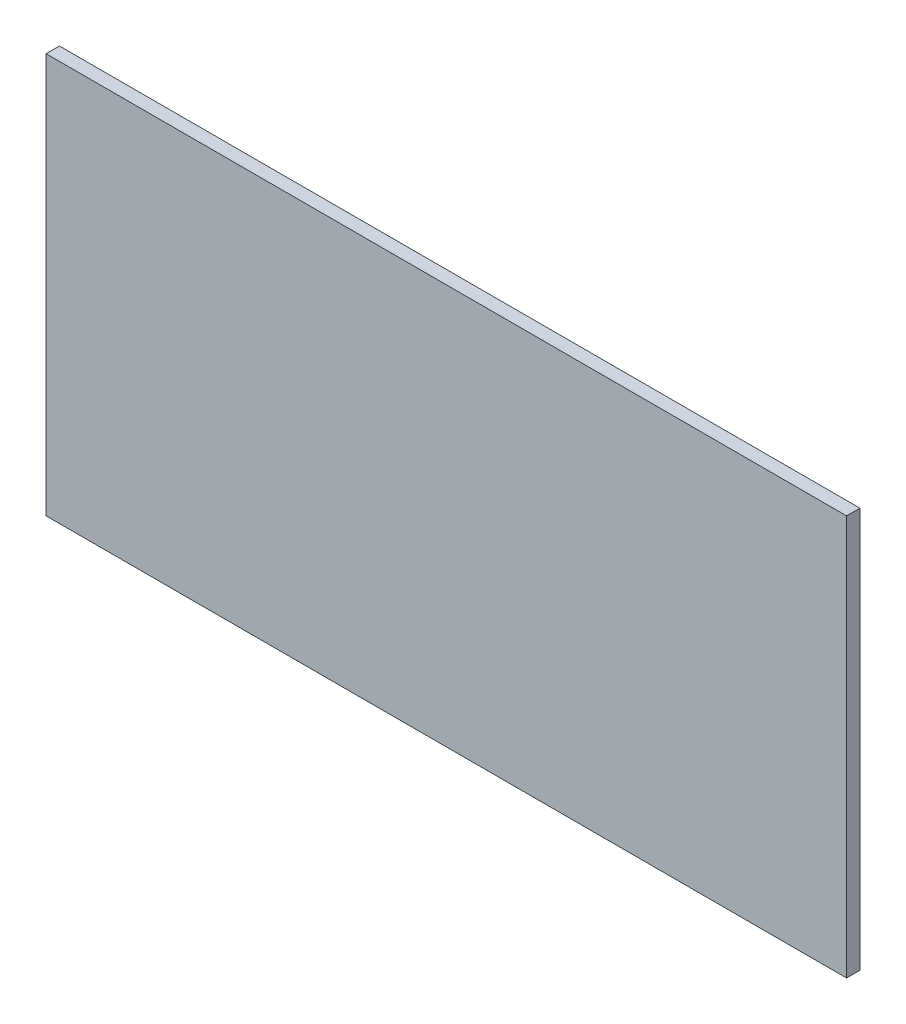
ISO-10303-21;
HEADER;
FILE_DESCRIPTION(('STEP AP214'),'2;1');
FILE_NAME('part.step','',(''),(''),'','','');
FILE_SCHEMA(('AUTOMOTIVE_DESIGN { 1 0 10303 214 1 1 1 1 }'));
ENDSEC;
DATA;
#1=APPLICATION_CONTEXT('core data for automotive mechanical design processes');
#2=APPLICATION_PROTOCOL_DEFINITION('international standard','automotive_design',2000,#1);
#3=PRODUCT_CONTEXT('',#1,'mechanical');
#4=PRODUCT('Part','Part','',(#3));
#5=PRODUCT_RELATED_PRODUCT_CATEGORY('part','',(#4));
#6=PRODUCT_DEFINITION_FORMATION('','',#4);
#7=PRODUCT_DEFINITION_CONTEXT('part definition',#1,'design');
#8=PRODUCT_DEFINITION('design','',#6,#7);
#9=PRODUCT_DEFINITION_SHAPE('','',#8);
#10=(LENGTH_UNIT() NAMED_UNIT(*) SI_UNIT(.MILLI.,.METRE.));
#11=(NAMED_UNIT(*) PLANE_ANGLE_UNIT() SI_UNIT($,.RADIAN.));
#12=(NAMED_UNIT(*) SI_UNIT($,.STERADIAN.) SOLID_ANGLE_UNIT());
#13=UNCERTAINTY_MEASURE_WITH_UNIT(LENGTH_MEASURE(1.E-05),#10,'distance_accuracy_value','');
#14=(GEOMETRIC_REPRESENTATION_CONTEXT(3) GLOBAL_UNCERTAINTY_ASSIGNED_CONTEXT((#13)) GLOBAL_UNIT_ASSIGNED_CONTEXT((#10,
#11,#12)) REPRESENTATION_CONTEXT('',''));
#15=CARTESIAN_POINT('',(0.,0.,0.));
#16=DIRECTION('',(0.,0.,1.));
#17=DIRECTION('',(1.,0.,0.));
#18=AXIS2_PLACEMENT_3D('',#15,#16,#17);
#19=CARTESIAN_POINT('',(0.,0.,0.));
#20=DIRECTION('',(0.,0.,-1.));
#21=DIRECTION('',(-1.,0.,0.));
#22=AXIS2_PLACEMENT_3D('',#19,#20,#21);
#23=PLANE('',#22);
#24=DIRECTION('',(0.,1.,0.));
#25=VECTOR('',#24,1.);
#26=CARTESIAN_POINT('',(300.,0.,0.));
#27=LINE('',#26,#25);
#28=CARTESIAN_POINT('',(300.,150.,0.));
#29=VERTEX_POINT('',#28);
#30=CARTESIAN_POINT('',(300.,0.,0.));
#31=VERTEX_POINT('',#30);
#32=EDGE_CURVE('E55',#29,#31,#27,.F.);
#33=ORIENTED_EDGE('',*,*,#32,.T.);
#34=DIRECTION('',(1.,0.,0.));
#35=VECTOR('',#34,1.);
#36=CARTESIAN_POINT('',(0.,0.,0.));
#37=LINE('',#36,#35);
#38=CARTESIAN_POINT('',(0.,0.,0.));
#39=VERTEX_POINT('',#38);
#40=EDGE_CURVE('E76',#31,#39,#37,.F.);
#41=ORIENTED_EDGE('',*,*,#40,.T.);
#42=DIRECTION('',(0.,1.,0.));
#43=VECTOR('',#42,1.);
#44=CARTESIAN_POINT('',(0.,0.,0.));
#45=LINE('',#44,#43);
#46=CARTESIAN_POINT('',(0.,150.,0.));
#47=VERTEX_POINT('',#46);
#48=EDGE_CURVE('E58',#39,#47,#45,.T.);
#49=ORIENTED_EDGE('',*,*,#48,.T.);
#50=DIRECTION('',(1.,0.,0.));
#51=VECTOR('',#50,1.);
#52=CARTESIAN_POINT('',(0.,150.,0.));
#53=LINE('',#52,#51);
#54=EDGE_CURVE('E20',#47,#29,#53,.T.);
#55=ORIENTED_EDGE('',*,*,#54,.T.);
#56=EDGE_LOOP('',(#33,#41,#49,#55));
#57=FACE_BOUND('',#56,.T.);
#58=ADVANCED_FACE('F17',(#57),#23,.T.);
#59=CARTESIAN_POINT('',(0.,150.,5.));
#60=DIRECTION('',(0.,-1.,0.));
#61=DIRECTION('',(0.,0.,-1.));
#62=AXIS2_PLACEMENT_3D('',#59,#60,#61);
#63=PLANE('',#62);
#64=DIRECTION('',(0.,0.,-1.));
#65=VECTOR('',#64,1.);
#66=CARTESIAN_POINT('',(0.,150.,5.));
#67=LINE('',#66,#65);
#68=CARTESIAN_POINT('',(0.,150.,5.));
#69=VERTEX_POINT('',#68);
#70=EDGE_CURVE('E78',#47,#69,#67,.F.);
#71=ORIENTED_EDGE('',*,*,#70,.T.);
#72=DIRECTION('',(-1.,0.,0.));
#73=VECTOR('',#72,1.);
#74=CARTESIAN_POINT('',(0.,150.,5.));
#75=LINE('',#74,#73);
#76=CARTESIAN_POINT('',(300.,150.,5.));
#77=VERTEX_POINT('',#76);
#78=EDGE_CURVE('E73',#69,#77,#75,.F.);
#79=ORIENTED_EDGE('',*,*,#78,.T.);
#80=DIRECTION('',(0.,0.,1.));
#81=VECTOR('',#80,1.);
#82=CARTESIAN_POINT('',(300.,150.,5.));
#83=LINE('',#82,#81);
#84=EDGE_CURVE('E63',#77,#29,#83,.F.);
#85=ORIENTED_EDGE('',*,*,#84,.T.);
#86=ORIENTED_EDGE('',*,*,#54,.F.);
#87=EDGE_LOOP('',(#71,#79,#85,#86));
#88=FACE_BOUND('',#87,.T.);
#89=ADVANCED_FACE('F72',(#88),#63,.F.);
#90=CARTESIAN_POINT('',(300.,0.,5.));
#91=DIRECTION('',(-1.,0.,0.));
#92=DIRECTION('',(0.,0.,1.));
#93=AXIS2_PLACEMENT_3D('',#90,#91,#92);
#94=PLANE('',#93);
#95=ORIENTED_EDGE('',*,*,#84,.F.);
#96=DIRECTION('',(0.,1.,0.));
#97=VECTOR('',#96,1.);
#98=CARTESIAN_POINT('',(300.,0.,5.));
#99=LINE('',#98,#97);
#100=CARTESIAN_POINT('',(300.,0.,5.));
#101=VERTEX_POINT('',#100);
#102=EDGE_CURVE('E83',#77,#101,#99,.F.);
#103=ORIENTED_EDGE('',*,*,#102,.T.);
#104=DIRECTION('',(0.,0.,1.));
#105=VECTOR('',#104,1.);
#106=CARTESIAN_POINT('',(300.,0.,5.));
#107=LINE('',#106,#105);
#108=EDGE_CURVE('E69',#101,#31,#107,.F.);
#109=ORIENTED_EDGE('',*,*,#108,.T.);
#110=ORIENTED_EDGE('',*,*,#32,.F.);
#111=EDGE_LOOP('',(#95,#103,#109,#110));
#112=FACE_BOUND('',#111,.T.);
#113=ADVANCED_FACE('F66',(#112),#94,.F.);
#114=CARTESIAN_POINT('',(0.,0.,5.));
#115=DIRECTION('',(0.,1.,0.));
#116=DIRECTION('',(0.,0.,1.));
#117=AXIS2_PLACEMENT_3D('',#114,#115,#116);
#118=PLANE('',#117);
#119=ORIENTED_EDGE('',*,*,#108,.F.);
#120=DIRECTION('',(-1.,0.,0.));
#121=VECTOR('',#120,1.);
#122=CARTESIAN_POINT('',(0.,0.,5.));
#123=LINE('',#122,#121);
#124=CARTESIAN_POINT('',(0.,0.,5.));
#125=VERTEX_POINT('',#124);
#126=EDGE_CURVE('E26',#101,#125,#123,.T.);
#127=ORIENTED_EDGE('',*,*,#126,.T.);
#128=DIRECTION('',(0.,0.,-1.));
#129=VECTOR('',#128,1.);
#130=CARTESIAN_POINT('',(0.,0.,5.));
#131=LINE('',#130,#129);
#132=EDGE_CURVE('E34',#125,#39,#131,.T.);
#133=ORIENTED_EDGE('',*,*,#132,.T.);
#134=ORIENTED_EDGE('',*,*,#40,.F.);
#135=EDGE_LOOP('',(#119,#127,#133,#134));
#136=FACE_BOUND('',#135,.T.);
#137=ADVANCED_FACE('F88',(#136),#118,.F.);
#138=CARTESIAN_POINT('',(0.,0.,5.));
#139=DIRECTION('',(1.,0.,0.));
#140=DIRECTION('',(0.,0.,-1.));
#141=AXIS2_PLACEMENT_3D('',#138,#139,#140);
#142=PLANE('',#141);
#143=ORIENTED_EDGE('',*,*,#132,.F.);
#144=DIRECTION('',(0.,1.,0.));
#145=VECTOR('',#144,1.);
#146=CARTESIAN_POINT('',(0.,0.,5.));
#147=LINE('',#146,#145);
#148=EDGE_CURVE('E11',#125,#69,#147,.T.);
#149=ORIENTED_EDGE('',*,*,#148,.T.);
#150=ORIENTED_EDGE('',*,*,#70,.F.);
#151=ORIENTED_EDGE('',*,*,#48,.F.);
#152=EDGE_LOOP('',(#143,#149,#150,#151));
#153=FACE_BOUND('',#152,.T.);
#154=ADVANCED_FACE('F91',(#153),#142,.F.);
#155=CARTESIAN_POINT('',(0.,0.,5.));
#156=DIRECTION('',(0.,0.,-1.));
#157=DIRECTION('',(-1.,0.,0.));
#158=AXIS2_PLACEMENT_3D('',#155,#156,#157);
#159=PLANE('',#158);
#160=ORIENTED_EDGE('',*,*,#126,.F.);
#161=ORIENTED_EDGE('',*,*,#102,.F.);
#162=ORIENTED_EDGE('',*,*,#78,.F.);
#163=ORIENTED_EDGE('',*,*,#148,.F.);
#164=EDGE_LOOP('',(#160,#161,#162,#163));
#165=FACE_BOUND('',#164,.T.);
#166=ADVANCED_FACE('F90',(#165),#159,.F.);
#167=CLOSED_SHELL('',(#58,#89,#113,#137,#154,#166));
#168=MANIFOLD_SOLID_BREP('B1',#167);
#169=ADVANCED_BREP_SHAPE_REPRESENTATION('',(#18,#168),#14);
#170=SHAPE_DEFINITION_REPRESENTATION(#9,#169);
ENDSEC;
END-ISO-10303-21;
